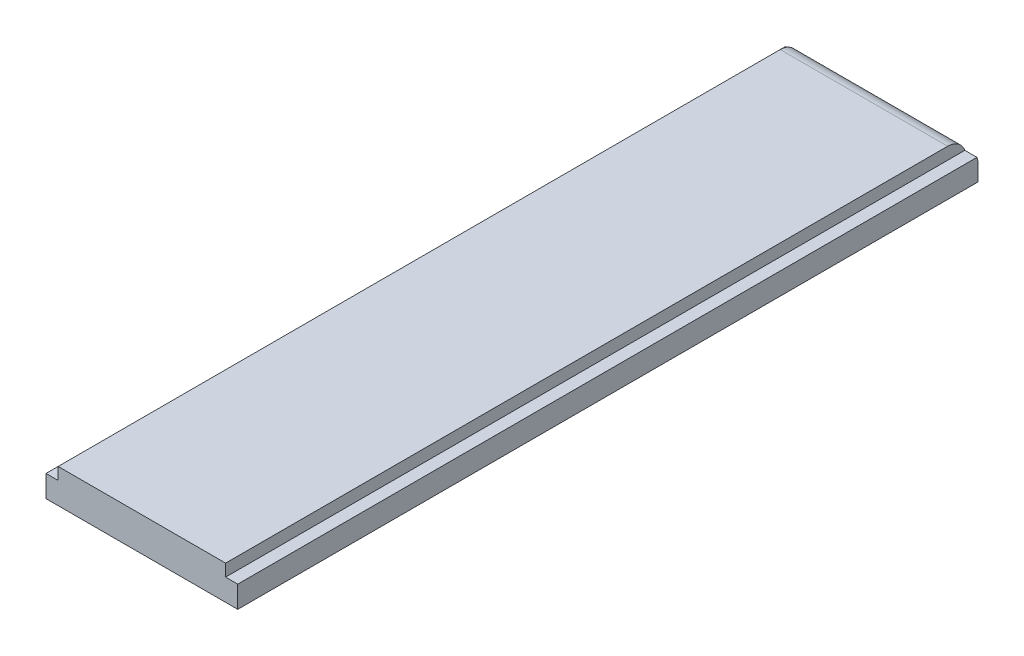
ISO-10303-21;
HEADER;
FILE_DESCRIPTION(('STEP AP214'),'2;1');
FILE_NAME('part.step','',(''),(''),'','','');
FILE_SCHEMA(('AUTOMOTIVE_DESIGN { 1 0 10303 214 1 1 1 1 }'));
ENDSEC;
DATA;
#1=APPLICATION_CONTEXT('core data for automotive mechanical design processes');
#2=APPLICATION_PROTOCOL_DEFINITION('international standard','automotive_design',2000,#1);
#3=PRODUCT_CONTEXT('',#1,'mechanical');
#4=PRODUCT('Part','Part','',(#3));
#5=PRODUCT_RELATED_PRODUCT_CATEGORY('part','',(#4));
#6=PRODUCT_DEFINITION_FORMATION('','',#4);
#7=PRODUCT_DEFINITION_CONTEXT('part definition',#1,'design');
#8=PRODUCT_DEFINITION('design','',#6,#7);
#9=PRODUCT_DEFINITION_SHAPE('','',#8);
#10=(LENGTH_UNIT() NAMED_UNIT(*) SI_UNIT(.MILLI.,.METRE.));
#11=(NAMED_UNIT(*) PLANE_ANGLE_UNIT() SI_UNIT($,.RADIAN.));
#12=(NAMED_UNIT(*) SI_UNIT($,.STERADIAN.) SOLID_ANGLE_UNIT());
#13=UNCERTAINTY_MEASURE_WITH_UNIT(LENGTH_MEASURE(1.E-05),#10,'distance_accuracy_value','');
#14=(GEOMETRIC_REPRESENTATION_CONTEXT(3) GLOBAL_UNCERTAINTY_ASSIGNED_CONTEXT((#13)) GLOBAL_UNIT_ASSIGNED_CONTEXT((#10,
#11,#12)) REPRESENTATION_CONTEXT('',''));
#15=CARTESIAN_POINT('',(0.,0.,0.));
#16=DIRECTION('',(0.,0.,1.));
#17=DIRECTION('',(1.,0.,0.));
#18=AXIS2_PLACEMENT_3D('',#15,#16,#17);
#19=CARTESIAN_POINT('',(0.,1.8,0.));
#20=DIRECTION('',(0.,-1.,0.));
#21=DIRECTION('',(0.,0.,-1.));
#22=AXIS2_PLACEMENT_3D('',#19,#20,#21);
#23=PLANE('',#22);
#24=DIRECTION('',(0.,0.,1.));
#25=VECTOR('',#24,1.);
#26=CARTESIAN_POINT('',(0.,1.8,0.));
#27=LINE('',#26,#25);
#28=CARTESIAN_POINT('',(0.,1.8,-61.9142135623731));
#29=VERTEX_POINT('',#28);
#30=CARTESIAN_POINT('',(0.,1.8,-1.));
#31=VERTEX_POINT('',#30);
#32=EDGE_CURVE('E128',#29,#31,#27,.T.);
#33=ORIENTED_EDGE('',*,*,#32,.T.);
#34=DIRECTION('',(1.,0.,0.));
#35=VECTOR('',#34,1.);
#36=CARTESIAN_POINT('',(0.,1.8,-1.));
#37=LINE('',#36,#35);
#38=CARTESIAN_POINT('',(1.00000000000001,1.8,-1.));
#39=VERTEX_POINT('',#38);
#40=EDGE_CURVE('E112',#31,#39,#37,.T.);
#41=ORIENTED_EDGE('',*,*,#40,.T.);
#42=DIRECTION('',(0.,0.,1.));
#43=VECTOR('',#42,1.);
#44=CARTESIAN_POINT('',(1.,1.8,-62.));
#45=LINE('',#44,#43);
#46=CARTESIAN_POINT('',(1.,1.8,-61.9142135623731));
#47=VERTEX_POINT('',#46);
#48=EDGE_CURVE('E145',#47,#39,#45,.T.);
#49=ORIENTED_EDGE('',*,*,#48,.F.);
#50=DIRECTION('',(1.,0.,0.));
#51=VECTOR('',#50,1.);
#52=CARTESIAN_POINT('',(1.,1.8,-61.9142135623731));
#53=LINE('',#52,#51);
#54=EDGE_CURVE('E152',#47,#29,#53,.F.);
#55=ORIENTED_EDGE('',*,*,#54,.T.);
#56=EDGE_LOOP('',(#33,#41,#49,#55));
#57=FACE_BOUND('',#56,.T.);
#58=ADVANCED_FACE('F33',(#57),#23,.F.);
#59=DIRECTION('',(0.,0.,-1.));
#60=VECTOR('',#59,1.);
#61=CARTESIAN_POINT('',(14.8,1.8,-62.));
#62=LINE('',#61,#60);
#63=CARTESIAN_POINT('',(14.8,1.8,-1.));
#64=VERTEX_POINT('',#63);
#65=CARTESIAN_POINT('',(14.8,1.8,-61.9142135623731));
#66=VERTEX_POINT('',#65);
#67=EDGE_CURVE('E141',#64,#66,#62,.T.);
#68=ORIENTED_EDGE('',*,*,#67,.F.);
#69=CARTESIAN_POINT('',(15.8,1.8,-1.));
#70=VERTEX_POINT('',#69);
#71=EDGE_CURVE('E113',#64,#70,#37,.T.);
#72=ORIENTED_EDGE('',*,*,#71,.T.);
#73=DIRECTION('',(0.,0.,-1.));
#74=VECTOR('',#73,1.);
#75=CARTESIAN_POINT('',(15.8,1.8,0.));
#76=LINE('',#75,#74);
#77=CARTESIAN_POINT('',(15.8,1.8,-61.9142135623731));
#78=VERTEX_POINT('',#77);
#79=EDGE_CURVE('E120',#70,#78,#76,.T.);
#80=ORIENTED_EDGE('',*,*,#79,.T.);
#81=DIRECTION('',(1.,0.,0.));
#82=VECTOR('',#81,1.);
#83=CARTESIAN_POINT('',(15.8,1.8,-61.9142135623731));
#84=LINE('',#83,#82);
#85=EDGE_CURVE('E150',#78,#66,#84,.F.);
#86=ORIENTED_EDGE('',*,*,#85,.T.);
#87=EDGE_LOOP('',(#68,#72,#80,#86));
#88=FACE_BOUND('',#87,.T.);
#89=ADVANCED_FACE('F164',(#88),#23,.F.);
#90=CARTESIAN_POINT('',(0.,1.8,0.));
#91=DIRECTION('',(1.,0.,0.));
#92=DIRECTION('',(0.,0.,-1.));
#93=AXIS2_PLACEMENT_3D('',#90,#91,#92);
#94=PLANE('',#93);
#95=DIRECTION('',(0.,0.,1.));
#96=VECTOR('',#95,1.);
#97=CARTESIAN_POINT('',(0.,0.,0.));
#98=LINE('',#97,#96);
#99=CARTESIAN_POINT('',(0.,0.,-62.));
#100=VERTEX_POINT('',#99);
#101=CARTESIAN_POINT('',(0.,0.,-1.));
#102=VERTEX_POINT('',#101);
#103=EDGE_CURVE('E126',#100,#102,#98,.T.);
#104=ORIENTED_EDGE('',*,*,#103,.T.);
#105=DIRECTION('',(0.,1.,0.));
#106=VECTOR('',#105,1.);
#107=CARTESIAN_POINT('',(0.,-7.2,-1.));
#108=LINE('',#107,#106);
#109=EDGE_CURVE('E48',#102,#31,#108,.T.);
#110=ORIENTED_EDGE('',*,*,#109,.T.);
#111=ORIENTED_EDGE('',*,*,#32,.F.);
#112=CARTESIAN_POINT('',(0.,1.3,-60.5));
#113=DIRECTION('',(1.,0.,0.));
#114=DIRECTION('',(0.,0.,-1.));
#115=AXIS2_PLACEMENT_3D('',#112,#113,#114);
#116=CIRCLE('',#115,1.5);
#117=CARTESIAN_POINT('',(0.,1.3,-62.));
#118=VERTEX_POINT('',#117);
#119=EDGE_CURVE('E154',#29,#118,#116,.F.);
#120=ORIENTED_EDGE('',*,*,#119,.T.);
#121=DIRECTION('',(0.,-1.,0.));
#122=VECTOR('',#121,1.);
#123=CARTESIAN_POINT('',(0.,1.8,-62.));
#124=LINE('',#123,#122);
#125=EDGE_CURVE('E134',#118,#100,#124,.T.);
#126=ORIENTED_EDGE('',*,*,#125,.T.);
#127=EDGE_LOOP('',(#104,#110,#111,#120,#126));
#128=FACE_BOUND('',#127,.T.);
#129=ADVANCED_FACE('F194',(#128),#94,.F.);
#130=CARTESIAN_POINT('',(15.8,1.8,0.));
#131=DIRECTION('',(-1.,0.,0.));
#132=DIRECTION('',(0.,0.,1.));
#133=AXIS2_PLACEMENT_3D('',#130,#131,#132);
#134=PLANE('',#133);
#135=ORIENTED_EDGE('',*,*,#79,.F.);
#136=DIRECTION('',(0.,1.,0.));
#137=VECTOR('',#136,1.);
#138=CARTESIAN_POINT('',(15.8,-7.2,-1.));
#139=LINE('',#138,#137);
#140=CARTESIAN_POINT('',(15.8,0.,-1.));
#141=VERTEX_POINT('',#140);
#142=EDGE_CURVE('E106',#141,#70,#139,.T.);
#143=ORIENTED_EDGE('',*,*,#142,.F.);
#144=DIRECTION('',(0.,0.,-1.));
#145=VECTOR('',#144,1.);
#146=CARTESIAN_POINT('',(15.8,0.,0.));
#147=LINE('',#146,#145);
#148=CARTESIAN_POINT('',(15.8,0.,-62.));
#149=VERTEX_POINT('',#148);
#150=EDGE_CURVE('E118',#141,#149,#147,.T.);
#151=ORIENTED_EDGE('',*,*,#150,.T.);
#152=DIRECTION('',(0.,-1.,0.));
#153=VECTOR('',#152,1.);
#154=CARTESIAN_POINT('',(15.8,1.8,-62.));
#155=LINE('',#154,#153);
#156=CARTESIAN_POINT('',(15.8,1.3,-62.));
#157=VERTEX_POINT('',#156);
#158=EDGE_CURVE('E136',#157,#149,#155,.T.);
#159=ORIENTED_EDGE('',*,*,#158,.F.);
#160=CARTESIAN_POINT('',(15.8,1.3,-60.5));
#161=DIRECTION('',(-1.,0.,0.));
#162=DIRECTION('',(0.,0.,1.));
#163=AXIS2_PLACEMENT_3D('',#160,#161,#162);
#164=CIRCLE('',#163,1.5);
#165=EDGE_CURVE('E41',#157,#78,#164,.F.);
#166=ORIENTED_EDGE('',*,*,#165,.T.);
#167=EDGE_LOOP('',(#135,#143,#151,#159,#166));
#168=FACE_BOUND('',#167,.T.);
#169=ADVANCED_FACE('F117',(#168),#134,.F.);
#170=CARTESIAN_POINT('',(0.,1.8,-62.));
#171=DIRECTION('',(0.,0.,1.));
#172=DIRECTION('',(1.,0.,0.));
#173=AXIS2_PLACEMENT_3D('',#170,#171,#172);
#174=PLANE('',#173);
#175=ORIENTED_EDGE('',*,*,#125,.F.);
#176=DIRECTION('',(-1.,0.,0.));
#177=VECTOR('',#176,1.);
#178=CARTESIAN_POINT('',(14.8,1.3,-62.));
#179=LINE('',#178,#177);
#180=EDGE_CURVE('E56',#118,#157,#179,.F.);
#181=ORIENTED_EDGE('',*,*,#180,.T.);
#182=ORIENTED_EDGE('',*,*,#158,.T.);
#183=DIRECTION('',(-1.,0.,0.));
#184=VECTOR('',#183,1.);
#185=CARTESIAN_POINT('',(0.,0.,-62.));
#186=LINE('',#185,#184);
#187=EDGE_CURVE('E125',#149,#100,#186,.T.);
#188=ORIENTED_EDGE('',*,*,#187,.T.);
#189=EDGE_LOOP('',(#175,#181,#182,#188));
#190=FACE_BOUND('',#189,.T.);
#191=ADVANCED_FACE('F207',(#190),#174,.F.);
#192=CARTESIAN_POINT('',(0.,0.,0.));
#193=DIRECTION('',(0.,-1.,0.));
#194=DIRECTION('',(0.,0.,-1.));
#195=AXIS2_PLACEMENT_3D('',#192,#193,#194);
#196=PLANE('',#195);
#197=DIRECTION('',(1.,0.,0.));
#198=VECTOR('',#197,1.);
#199=CARTESIAN_POINT('',(0.,0.,-1.));
#200=LINE('',#199,#198);
#201=EDGE_CURVE('E102',#102,#141,#200,.T.);
#202=ORIENTED_EDGE('',*,*,#201,.F.);
#203=ORIENTED_EDGE('',*,*,#103,.F.);
#204=ORIENTED_EDGE('',*,*,#187,.F.);
#205=ORIENTED_EDGE('',*,*,#150,.F.);
#206=EDGE_LOOP('',(#202,#203,#204,#205));
#207=FACE_BOUND('',#206,.T.);
#208=ADVANCED_FACE('F123',(#207),#196,.T.);
#209=CARTESIAN_POINT('',(1.,2.8,-62.));
#210=DIRECTION('',(1.,0.,0.));
#211=DIRECTION('',(0.,0.,-1.));
#212=AXIS2_PLACEMENT_3D('',#209,#210,#211);
#213=PLANE('',#212);
#214=DIRECTION('',(0.,0.,1.));
#215=VECTOR('',#214,1.);
#216=CARTESIAN_POINT('',(1.,2.8,-62.));
#217=LINE('',#216,#215);
#218=CARTESIAN_POINT('',(1.,2.8,-60.5));
#219=VERTEX_POINT('',#218);
#220=CARTESIAN_POINT('',(1.00000000000001,2.8,-1.));
#221=VERTEX_POINT('',#220);
#222=EDGE_CURVE('E172',#219,#221,#217,.T.);
#223=ORIENTED_EDGE('',*,*,#222,.F.);
#224=CARTESIAN_POINT('',(1.,1.3,-60.5));
#225=DIRECTION('',(1.,0.,0.));
#226=DIRECTION('',(0.,0.,-1.));
#227=AXIS2_PLACEMENT_3D('',#224,#225,#226);
#228=CIRCLE('',#227,1.5);
#229=EDGE_CURVE('E148',#219,#47,#228,.F.);
#230=ORIENTED_EDGE('',*,*,#229,.T.);
#231=ORIENTED_EDGE('',*,*,#48,.T.);
#232=DIRECTION('',(0.,-1.,0.));
#233=VECTOR('',#232,1.);
#234=CARTESIAN_POINT('',(1.00000000000001,2.8,-1.));
#235=LINE('',#234,#233);
#236=EDGE_CURVE('E130',#221,#39,#235,.T.);
#237=ORIENTED_EDGE('',*,*,#236,.F.);
#238=EDGE_LOOP('',(#223,#230,#231,#237));
#239=FACE_BOUND('',#238,.T.);
#240=ADVANCED_FACE('F198',(#239),#213,.F.);
#241=CARTESIAN_POINT('',(1.00000000000001,2.8,-1.));
#242=DIRECTION('',(0.,0.,-1.));
#243=DIRECTION('',(-1.,0.,0.));
#244=AXIS2_PLACEMENT_3D('',#241,#242,#243);
#245=PLANE('',#244);
#246=ORIENTED_EDGE('',*,*,#236,.T.);
#247=ORIENTED_EDGE('',*,*,#40,.F.);
#248=ORIENTED_EDGE('',*,*,#109,.F.);
#249=ORIENTED_EDGE('',*,*,#201,.T.);
#250=ORIENTED_EDGE('',*,*,#142,.T.);
#251=ORIENTED_EDGE('',*,*,#71,.F.);
#252=DIRECTION('',(0.,-1.,0.));
#253=VECTOR('',#252,1.);
#254=CARTESIAN_POINT('',(14.8,2.8,-1.));
#255=LINE('',#254,#253);
#256=CARTESIAN_POINT('',(14.8,2.8,-1.));
#257=VERTEX_POINT('',#256);
#258=EDGE_CURVE('E171',#257,#64,#255,.T.);
#259=ORIENTED_EDGE('',*,*,#258,.F.);
#260=DIRECTION('',(1.,0.,0.));
#261=VECTOR('',#260,1.);
#262=CARTESIAN_POINT('',(1.00000000000001,2.8,-1.));
#263=LINE('',#262,#261);
#264=EDGE_CURVE('E173',#221,#257,#263,.T.);
#265=ORIENTED_EDGE('',*,*,#264,.F.);
#266=EDGE_LOOP('',(#246,#247,#248,#249,#250,#251,#259,#265));
#267=FACE_BOUND('',#266,.T.);
#268=ADVANCED_FACE('F105',(#267),#245,.F.);
#269=CARTESIAN_POINT('',(14.8,2.8,-62.));
#270=DIRECTION('',(-1.,0.,0.));
#271=DIRECTION('',(0.,0.,1.));
#272=AXIS2_PLACEMENT_3D('',#269,#270,#271);
#273=PLANE('',#272);
#274=ORIENTED_EDGE('',*,*,#67,.T.);
#275=CARTESIAN_POINT('',(14.8,1.3,-60.5));
#276=DIRECTION('',(-1.,0.,0.));
#277=DIRECTION('',(0.,0.,1.));
#278=AXIS2_PLACEMENT_3D('',#275,#276,#277);
#279=CIRCLE('',#278,1.5);
#280=CARTESIAN_POINT('',(14.8,2.8,-60.5));
#281=VERTEX_POINT('',#280);
#282=EDGE_CURVE('E11',#66,#281,#279,.F.);
#283=ORIENTED_EDGE('',*,*,#282,.T.);
#284=DIRECTION('',(0.,0.,-1.));
#285=VECTOR('',#284,1.);
#286=CARTESIAN_POINT('',(14.8,2.8,-62.));
#287=LINE('',#286,#285);
#288=EDGE_CURVE('E179',#257,#281,#287,.T.);
#289=ORIENTED_EDGE('',*,*,#288,.F.);
#290=ORIENTED_EDGE('',*,*,#258,.T.);
#291=EDGE_LOOP('',(#274,#283,#289,#290));
#292=FACE_BOUND('',#291,.T.);
#293=ADVANCED_FACE('F167',(#292),#273,.F.);
#294=CARTESIAN_POINT('',(0.,2.8,0.));
#295=DIRECTION('',(0.,1.,0.));
#296=DIRECTION('',(0.,0.,1.));
#297=AXIS2_PLACEMENT_3D('',#294,#295,#296);
#298=PLANE('',#297);
#299=ORIENTED_EDGE('',*,*,#288,.T.);
#300=DIRECTION('',(-1.,0.,0.));
#301=VECTOR('',#300,1.);
#302=CARTESIAN_POINT('',(1.,2.8,-60.5));
#303=LINE('',#302,#301);
#304=EDGE_CURVE('E138',#281,#219,#303,.T.);
#305=ORIENTED_EDGE('',*,*,#304,.T.);
#306=ORIENTED_EDGE('',*,*,#222,.T.);
#307=ORIENTED_EDGE('',*,*,#264,.T.);
#308=EDGE_LOOP('',(#299,#305,#306,#307));
#309=FACE_BOUND('',#308,.T.);
#310=ADVANCED_FACE('F196',(#309),#298,.T.);
#311=CARTESIAN_POINT('',(0.,1.3,-60.5));
#312=DIRECTION('',(1.,0.,0.));
#313=DIRECTION('',(0.,0.,-1.));
#314=AXIS2_PLACEMENT_3D('',#311,#312,#313);
#315=CYLINDRICAL_SURFACE('',#314,1.5);
#316=ORIENTED_EDGE('',*,*,#165,.F.);
#317=ORIENTED_EDGE('',*,*,#180,.F.);
#318=ORIENTED_EDGE('',*,*,#119,.F.);
#319=ORIENTED_EDGE('',*,*,#54,.F.);
#320=ORIENTED_EDGE('',*,*,#229,.F.);
#321=ORIENTED_EDGE('',*,*,#304,.F.);
#322=ORIENTED_EDGE('',*,*,#282,.F.);
#323=ORIENTED_EDGE('',*,*,#85,.F.);
#324=EDGE_LOOP('',(#316,#317,#318,#319,#320,#321,#322,#323));
#325=FACE_BOUND('',#324,.T.);
#326=ADVANCED_FACE('F35',(#325),#315,.T.);
#327=CLOSED_SHELL('',(#58,#89,#129,#169,#191,#208,#240,#268,#293,#310,#326));
#328=MANIFOLD_SOLID_BREP('B2',#327);
#329=ADVANCED_BREP_SHAPE_REPRESENTATION('',(#18,#328),#14);
#330=SHAPE_DEFINITION_REPRESENTATION(#9,#329);
ENDSEC;
END-ISO-10303-21;
